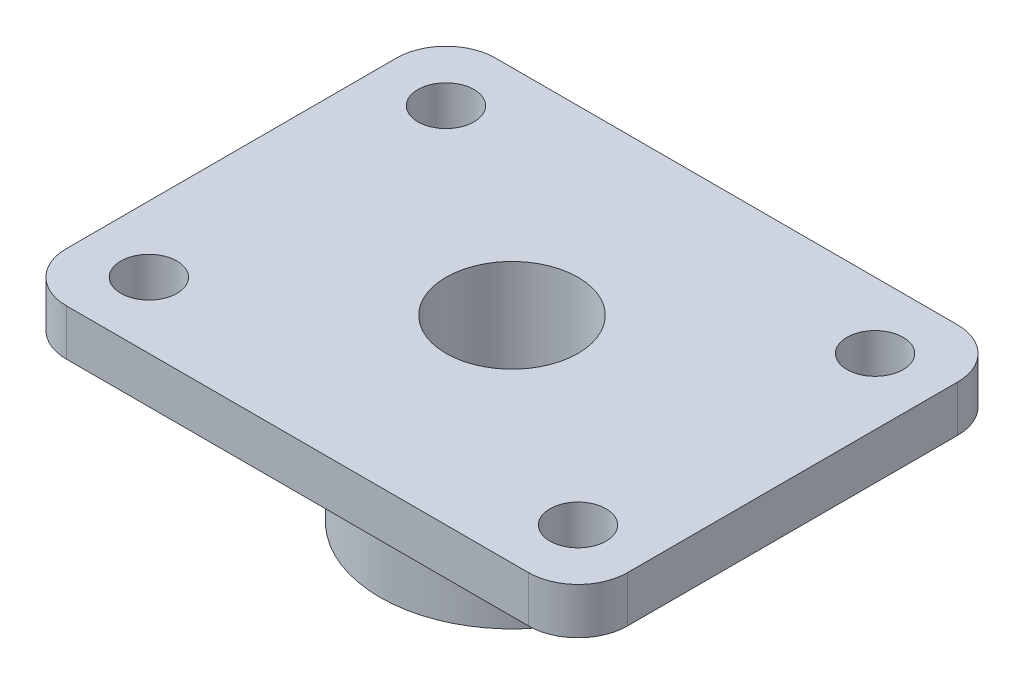
ISO-10303-21;
HEADER;
FILE_DESCRIPTION(('STEP AP214'),'2;1');
FILE_NAME('part.step','',(''),(''),'','','');
FILE_SCHEMA(('AUTOMOTIVE_DESIGN { 1 0 10303 214 1 1 1 1 }'));
ENDSEC;
DATA;
#1=APPLICATION_CONTEXT('core data for automotive mechanical design processes');
#2=APPLICATION_PROTOCOL_DEFINITION('international standard','automotive_design',2000,#1);
#3=PRODUCT_CONTEXT('',#1,'mechanical');
#4=PRODUCT('Part','Part','',(#3));
#5=PRODUCT_RELATED_PRODUCT_CATEGORY('part','',(#4));
#6=PRODUCT_DEFINITION_FORMATION('','',#4);
#7=PRODUCT_DEFINITION_CONTEXT('part definition',#1,'design');
#8=PRODUCT_DEFINITION('design','',#6,#7);
#9=PRODUCT_DEFINITION_SHAPE('','',#8);
#10=(LENGTH_UNIT() NAMED_UNIT(*) SI_UNIT(.MILLI.,.METRE.));
#11=(NAMED_UNIT(*) PLANE_ANGLE_UNIT() SI_UNIT($,.RADIAN.));
#12=(NAMED_UNIT(*) SI_UNIT($,.STERADIAN.) SOLID_ANGLE_UNIT());
#13=UNCERTAINTY_MEASURE_WITH_UNIT(LENGTH_MEASURE(1.E-05),#10,'distance_accuracy_value','');
#14=(GEOMETRIC_REPRESENTATION_CONTEXT(3) GLOBAL_UNCERTAINTY_ASSIGNED_CONTEXT((#13)) GLOBAL_UNIT_ASSIGNED_CONTEXT((#10,
#11,#12)) REPRESENTATION_CONTEXT('',''));
#15=CARTESIAN_POINT('',(0.,0.,0.));
#16=DIRECTION('',(0.,0.,1.));
#17=DIRECTION('',(1.,0.,0.));
#18=AXIS2_PLACEMENT_3D('',#15,#16,#17);
#19=CARTESIAN_POINT('',(70.,0.,50.));
#20=DIRECTION('',(0.,1.,0.));
#21=DIRECTION('',(0.,0.,1.));
#22=AXIS2_PLACEMENT_3D('',#19,#20,#21);
#23=PLANE('',#22);
#24=CARTESIAN_POINT('',(-65.0000000000003,0.,-44.9999999999995));
#25=DIRECTION('',(0.,1.,0.));
#26=DIRECTION('',(0.,0.,1.));
#27=AXIS2_PLACEMENT_3D('',#24,#25,#26);
#28=CIRCLE('',#27,8.50000000000001);
#29=CARTESIAN_POINT('',(-65.0000000000003,0.,-36.4999999999995));
#30=VERTEX_POINT('',#29);
#31=EDGE_CURVE('E207',#30,#30,#28,.T.);
#32=ORIENTED_EDGE('',*,*,#31,.T.);
#33=EDGE_LOOP('',(#32));
#34=FACE_BOUND('',#33,.T.);
#35=CARTESIAN_POINT('',(-64.9999999999997,0.,45.0000000000004));
#36=DIRECTION('',(0.,1.,0.));
#37=DIRECTION('',(0.,0.,-1.));
#38=AXIS2_PLACEMENT_3D('',#35,#36,#37);
#39=CIRCLE('',#38,8.49999999999998);
#40=CARTESIAN_POINT('',(-64.9999999999997,0.,36.5000000000005));
#41=VERTEX_POINT('',#40);
#42=EDGE_CURVE('E201',#41,#41,#39,.T.);
#43=ORIENTED_EDGE('',*,*,#42,.T.);
#44=EDGE_LOOP('',(#43));
#45=FACE_BOUND('',#44,.T.);
#46=CARTESIAN_POINT('',(65.,0.,-45.));
#47=DIRECTION('',(0.,1.,0.));
#48=DIRECTION('',(0.,0.,-1.));
#49=AXIS2_PLACEMENT_3D('',#46,#47,#48);
#50=CIRCLE('',#49,8.5);
#51=CARTESIAN_POINT('',(65.,0.,-53.5));
#52=VERTEX_POINT('',#51);
#53=EDGE_CURVE('E195',#52,#52,#50,.T.);
#54=ORIENTED_EDGE('',*,*,#53,.T.);
#55=EDGE_LOOP('',(#54));
#56=FACE_BOUND('',#55,.T.);
#57=CARTESIAN_POINT('',(65.,0.,45.));
#58=DIRECTION('',(0.,1.,0.));
#59=DIRECTION('',(0.,0.,1.));
#60=AXIS2_PLACEMENT_3D('',#57,#58,#59);
#61=CIRCLE('',#60,8.5);
#62=CARTESIAN_POINT('',(65.,0.,53.5));
#63=VERTEX_POINT('',#62);
#64=EDGE_CURVE('E189',#63,#63,#61,.T.);
#65=ORIENTED_EDGE('',*,*,#64,.T.);
#66=EDGE_LOOP('',(#65));
#67=FACE_BOUND('',#66,.T.);
#68=CARTESIAN_POINT('',(70.,0.,50.));
#69=DIRECTION('',(0.,1.,0.));
#70=DIRECTION('',(0.,0.,1.));
#71=AXIS2_PLACEMENT_3D('',#68,#69,#70);
#72=CIRCLE('',#71,15.);
#73=CARTESIAN_POINT('',(69.9999999999999,0.,65.));
#74=VERTEX_POINT('',#73);
#75=CARTESIAN_POINT('',(85.,0.,49.9999999999999));
#76=VERTEX_POINT('',#75);
#77=EDGE_CURVE('E134',#74,#76,#72,.T.);
#78=ORIENTED_EDGE('',*,*,#77,.F.);
#79=DIRECTION('',(1.,0.,0.));
#80=VECTOR('',#79,1.);
#81=CARTESIAN_POINT('',(-69.9999999999999,0.,65.));
#82=LINE('',#81,#80);
#83=CARTESIAN_POINT('',(-69.9999999999999,0.,65.));
#84=VERTEX_POINT('',#83);
#85=EDGE_CURVE('E87',#84,#74,#82,.T.);
#86=ORIENTED_EDGE('',*,*,#85,.F.);
#87=CARTESIAN_POINT('',(-70.,0.,50.));
#88=DIRECTION('',(0.,1.,0.));
#89=DIRECTION('',(0.,0.,1.));
#90=AXIS2_PLACEMENT_3D('',#87,#88,#89);
#91=CIRCLE('',#90,15.);
#92=CARTESIAN_POINT('',(-85.,0.,49.9999999999999));
#93=VERTEX_POINT('',#92);
#94=EDGE_CURVE('E81',#93,#84,#91,.T.);
#95=ORIENTED_EDGE('',*,*,#94,.F.);
#96=DIRECTION('',(0.,0.,1.));
#97=VECTOR('',#96,1.);
#98=CARTESIAN_POINT('',(-85.,0.,-49.9999999999999));
#99=LINE('',#98,#97);
#100=CARTESIAN_POINT('',(-85.,0.,-49.9999999999999));
#101=VERTEX_POINT('',#100);
#102=EDGE_CURVE('E124',#101,#93,#99,.T.);
#103=ORIENTED_EDGE('',*,*,#102,.F.);
#104=CARTESIAN_POINT('',(-70.,0.,-50.));
#105=DIRECTION('',(0.,1.,0.));
#106=DIRECTION('',(0.,0.,1.));
#107=AXIS2_PLACEMENT_3D('',#104,#105,#106);
#108=CIRCLE('',#107,15.);
#109=CARTESIAN_POINT('',(-69.9999999999999,0.,-65.));
#110=VERTEX_POINT('',#109);
#111=EDGE_CURVE('E144',#110,#101,#108,.T.);
#112=ORIENTED_EDGE('',*,*,#111,.F.);
#113=DIRECTION('',(-1.,0.,0.));
#114=VECTOR('',#113,1.);
#115=CARTESIAN_POINT('',(-69.9999999999999,0.,-65.));
#116=LINE('',#115,#114);
#117=CARTESIAN_POINT('',(69.9999999999999,0.,-65.));
#118=VERTEX_POINT('',#117);
#119=EDGE_CURVE('E142',#118,#110,#116,.T.);
#120=ORIENTED_EDGE('',*,*,#119,.F.);
#121=CARTESIAN_POINT('',(70.,0.,-50.));
#122=DIRECTION('',(0.,1.,0.));
#123=DIRECTION('',(0.,0.,-1.));
#124=AXIS2_PLACEMENT_3D('',#121,#122,#123);
#125=CIRCLE('',#124,15.);
#126=CARTESIAN_POINT('',(85.,0.,-49.9999999999999));
#127=VERTEX_POINT('',#126);
#128=EDGE_CURVE('E140',#127,#118,#125,.T.);
#129=ORIENTED_EDGE('',*,*,#128,.F.);
#130=DIRECTION('',(0.,0.,-1.));
#131=VECTOR('',#130,1.);
#132=CARTESIAN_POINT('',(85.,0.,-49.9999999999999));
#133=LINE('',#132,#131);
#134=EDGE_CURVE('E137',#76,#127,#133,.T.);
#135=ORIENTED_EDGE('',*,*,#134,.F.);
#136=EDGE_LOOP('',(#78,#86,#95,#103,#112,#120,#129,#135));
#137=FACE_BOUND('',#136,.T.);
#138=CARTESIAN_POINT('',(0.,0.,0.));
#139=DIRECTION('',(0.,1.,0.));
#140=DIRECTION('',(0.,0.,1.));
#141=AXIS2_PLACEMENT_3D('',#138,#139,#140);
#142=CIRCLE('',#141,40.);
#143=CARTESIAN_POINT('',(0.,0.,40.));
#144=VERTEX_POINT('',#143);
#145=EDGE_CURVE('E11',#144,#144,#142,.F.);
#146=ORIENTED_EDGE('',*,*,#145,.F.);
#147=EDGE_LOOP('',(#146));
#148=FACE_BOUND('',#147,.T.);
#149=ADVANCED_FACE('F35',(#34,#45,#56,#67,#137,#148),#23,.F.);
#150=CARTESIAN_POINT('',(70.,14.,50.));
#151=DIRECTION('',(0.,1.,0.));
#152=DIRECTION('',(0.,0.,1.));
#153=AXIS2_PLACEMENT_3D('',#150,#151,#152);
#154=PLANE('',#153);
#155=CARTESIAN_POINT('',(-64.9999999999997,14.,45.0000000000004));
#156=DIRECTION('',(0.,1.,0.));
#157=DIRECTION('',(0.,0.,-1.));
#158=AXIS2_PLACEMENT_3D('',#155,#156,#157);
#159=CIRCLE('',#158,8.49999999999998);
#160=CARTESIAN_POINT('',(-64.9999999999997,14.,36.5000000000005));
#161=VERTEX_POINT('',#160);
#162=EDGE_CURVE('E198',#161,#161,#159,.T.);
#163=ORIENTED_EDGE('',*,*,#162,.F.);
#164=EDGE_LOOP('',(#163));
#165=FACE_BOUND('',#164,.T.);
#166=CARTESIAN_POINT('',(65.,14.,45.));
#167=DIRECTION('',(0.,1.,0.));
#168=DIRECTION('',(0.,0.,1.));
#169=AXIS2_PLACEMENT_3D('',#166,#167,#168);
#170=CIRCLE('',#169,8.5);
#171=CARTESIAN_POINT('',(65.,14.,53.5));
#172=VERTEX_POINT('',#171);
#173=EDGE_CURVE('E188',#172,#172,#170,.T.);
#174=ORIENTED_EDGE('',*,*,#173,.F.);
#175=EDGE_LOOP('',(#174));
#176=FACE_BOUND('',#175,.T.);
#177=CARTESIAN_POINT('',(70.,14.,50.));
#178=DIRECTION('',(0.,1.,0.));
#179=DIRECTION('',(0.,0.,1.));
#180=AXIS2_PLACEMENT_3D('',#177,#178,#179);
#181=CIRCLE('',#180,15.);
#182=CARTESIAN_POINT('',(69.9999999999999,14.,65.));
#183=VERTEX_POINT('',#182);
#184=CARTESIAN_POINT('',(85.,14.,49.9999999999999));
#185=VERTEX_POINT('',#184);
#186=EDGE_CURVE('E149',#183,#185,#181,.T.);
#187=ORIENTED_EDGE('',*,*,#186,.T.);
#188=DIRECTION('',(0.,0.,-1.));
#189=VECTOR('',#188,1.);
#190=CARTESIAN_POINT('',(85.,14.,-49.9999999999999));
#191=LINE('',#190,#189);
#192=CARTESIAN_POINT('',(85.,14.,-49.9999999999999));
#193=VERTEX_POINT('',#192);
#194=EDGE_CURVE('E96',#185,#193,#191,.T.);
#195=ORIENTED_EDGE('',*,*,#194,.T.);
#196=CARTESIAN_POINT('',(70.,14.,-50.));
#197=DIRECTION('',(0.,1.,0.));
#198=DIRECTION('',(0.,0.,-1.));
#199=AXIS2_PLACEMENT_3D('',#196,#197,#198);
#200=CIRCLE('',#199,15.);
#201=CARTESIAN_POINT('',(69.9999999999999,14.,-65.));
#202=VERTEX_POINT('',#201);
#203=EDGE_CURVE('E180',#193,#202,#200,.T.);
#204=ORIENTED_EDGE('',*,*,#203,.T.);
#205=DIRECTION('',(-1.,0.,0.));
#206=VECTOR('',#205,1.);
#207=CARTESIAN_POINT('',(-69.9999999999999,14.,-65.));
#208=LINE('',#207,#206);
#209=CARTESIAN_POINT('',(-69.9999999999999,14.,-65.));
#210=VERTEX_POINT('',#209);
#211=EDGE_CURVE('E179',#202,#210,#208,.T.);
#212=ORIENTED_EDGE('',*,*,#211,.T.);
#213=CARTESIAN_POINT('',(-70.,14.,-50.));
#214=DIRECTION('',(0.,1.,0.));
#215=DIRECTION('',(0.,0.,1.));
#216=AXIS2_PLACEMENT_3D('',#213,#214,#215);
#217=CIRCLE('',#216,15.);
#218=CARTESIAN_POINT('',(-85.,14.,-49.9999999999999));
#219=VERTEX_POINT('',#218);
#220=EDGE_CURVE('E116',#210,#219,#217,.T.);
#221=ORIENTED_EDGE('',*,*,#220,.T.);
#222=DIRECTION('',(0.,0.,1.));
#223=VECTOR('',#222,1.);
#224=CARTESIAN_POINT('',(-85.,14.,-49.9999999999999));
#225=LINE('',#224,#223);
#226=CARTESIAN_POINT('',(-85.,14.,49.9999999999999));
#227=VERTEX_POINT('',#226);
#228=EDGE_CURVE('E109',#219,#227,#225,.T.);
#229=ORIENTED_EDGE('',*,*,#228,.T.);
#230=CARTESIAN_POINT('',(-70.,14.,50.));
#231=DIRECTION('',(0.,1.,0.));
#232=DIRECTION('',(0.,0.,1.));
#233=AXIS2_PLACEMENT_3D('',#230,#231,#232);
#234=CIRCLE('',#233,15.);
#235=CARTESIAN_POINT('',(-69.9999999999999,14.,65.));
#236=VERTEX_POINT('',#235);
#237=EDGE_CURVE('E114',#227,#236,#234,.T.);
#238=ORIENTED_EDGE('',*,*,#237,.T.);
#239=DIRECTION('',(1.,0.,0.));
#240=VECTOR('',#239,1.);
#241=CARTESIAN_POINT('',(-69.9999999999999,14.,65.));
#242=LINE('',#241,#240);
#243=EDGE_CURVE('E52',#236,#183,#242,.T.);
#244=ORIENTED_EDGE('',*,*,#243,.T.);
#245=EDGE_LOOP('',(#187,#195,#204,#212,#221,#229,#238,#244));
#246=FACE_BOUND('',#245,.T.);
#247=CARTESIAN_POINT('',(0.,14.,0.));
#248=DIRECTION('',(0.,1.,0.));
#249=DIRECTION('',(0.,0.,1.));
#250=AXIS2_PLACEMENT_3D('',#247,#248,#249);
#251=CIRCLE('',#250,20.);
#252=CARTESIAN_POINT('',(0.,14.,20.));
#253=VERTEX_POINT('',#252);
#254=EDGE_CURVE('E138',#253,#253,#251,.T.);
#255=ORIENTED_EDGE('',*,*,#254,.F.);
#256=EDGE_LOOP('',(#255));
#257=FACE_BOUND('',#256,.T.);
#258=CARTESIAN_POINT('',(65.,14.,-45.));
#259=DIRECTION('',(0.,1.,0.));
#260=DIRECTION('',(0.,0.,-1.));
#261=AXIS2_PLACEMENT_3D('',#258,#259,#260);
#262=CIRCLE('',#261,8.5);
#263=CARTESIAN_POINT('',(65.,14.,-53.5));
#264=VERTEX_POINT('',#263);
#265=EDGE_CURVE('E192',#264,#264,#262,.T.);
#266=ORIENTED_EDGE('',*,*,#265,.F.);
#267=EDGE_LOOP('',(#266));
#268=FACE_BOUND('',#267,.T.);
#269=CARTESIAN_POINT('',(-65.0000000000003,14.,-44.9999999999995));
#270=DIRECTION('',(0.,1.,0.));
#271=DIRECTION('',(0.,0.,1.));
#272=AXIS2_PLACEMENT_3D('',#269,#270,#271);
#273=CIRCLE('',#272,8.50000000000001);
#274=CARTESIAN_POINT('',(-65.0000000000003,14.,-36.4999999999995));
#275=VERTEX_POINT('',#274);
#276=EDGE_CURVE('E204',#275,#275,#273,.T.);
#277=ORIENTED_EDGE('',*,*,#276,.F.);
#278=EDGE_LOOP('',(#277));
#279=FACE_BOUND('',#278,.T.);
#280=ADVANCED_FACE('F111',(#165,#176,#246,#257,#268,#279),#154,.T.);
#281=CARTESIAN_POINT('',(70.,14.,50.));
#282=DIRECTION('',(0.,-1.,0.));
#283=DIRECTION('',(0.,0.,-1.));
#284=AXIS2_PLACEMENT_3D('',#281,#282,#283);
#285=CYLINDRICAL_SURFACE('',#284,15.);
#286=ORIENTED_EDGE('',*,*,#77,.T.);
#287=DIRECTION('',(0.,-1.,0.));
#288=VECTOR('',#287,1.);
#289=CARTESIAN_POINT('',(85.,14.,49.9999999999999));
#290=LINE('',#289,#288);
#291=EDGE_CURVE('E44',#185,#76,#290,.T.);
#292=ORIENTED_EDGE('',*,*,#291,.F.);
#293=ORIENTED_EDGE('',*,*,#186,.F.);
#294=DIRECTION('',(0.,-1.,0.));
#295=VECTOR('',#294,1.);
#296=CARTESIAN_POINT('',(69.9999999999999,14.,65.));
#297=LINE('',#296,#295);
#298=EDGE_CURVE('E130',#183,#74,#297,.T.);
#299=ORIENTED_EDGE('',*,*,#298,.T.);
#300=EDGE_LOOP('',(#286,#292,#293,#299));
#301=FACE_BOUND('',#300,.T.);
#302=ADVANCED_FACE('F37',(#301),#285,.T.);
#303=CARTESIAN_POINT('',(85.,14.,-49.9999999999999));
#304=DIRECTION('',(-1.,0.,0.));
#305=DIRECTION('',(0.,0.,1.));
#306=AXIS2_PLACEMENT_3D('',#303,#304,#305);
#307=PLANE('',#306);
#308=ORIENTED_EDGE('',*,*,#134,.T.);
#309=DIRECTION('',(0.,-1.,0.));
#310=VECTOR('',#309,1.);
#311=CARTESIAN_POINT('',(85.,14.,-49.9999999999999));
#312=LINE('',#311,#310);
#313=EDGE_CURVE('E159',#193,#127,#312,.T.);
#314=ORIENTED_EDGE('',*,*,#313,.F.);
#315=ORIENTED_EDGE('',*,*,#194,.F.);
#316=ORIENTED_EDGE('',*,*,#291,.T.);
#317=EDGE_LOOP('',(#308,#314,#315,#316));
#318=FACE_BOUND('',#317,.T.);
#319=ADVANCED_FACE('F162',(#318),#307,.F.);
#320=CARTESIAN_POINT('',(70.,14.,-50.));
#321=DIRECTION('',(0.,-1.,0.));
#322=DIRECTION('',(0.,0.,-1.));
#323=AXIS2_PLACEMENT_3D('',#320,#321,#322);
#324=CYLINDRICAL_SURFACE('',#323,15.);
#325=ORIENTED_EDGE('',*,*,#128,.T.);
#326=DIRECTION('',(0.,-1.,0.));
#327=VECTOR('',#326,1.);
#328=CARTESIAN_POINT('',(69.9999999999999,14.,-65.));
#329=LINE('',#328,#327);
#330=EDGE_CURVE('E156',#202,#118,#329,.T.);
#331=ORIENTED_EDGE('',*,*,#330,.F.);
#332=ORIENTED_EDGE('',*,*,#203,.F.);
#333=ORIENTED_EDGE('',*,*,#313,.T.);
#334=EDGE_LOOP('',(#325,#331,#332,#333));
#335=FACE_BOUND('',#334,.T.);
#336=ADVANCED_FACE('F173',(#335),#324,.T.);
#337=CARTESIAN_POINT('',(-69.9999999999999,14.,-65.));
#338=DIRECTION('',(0.,0.,1.));
#339=DIRECTION('',(1.,0.,0.));
#340=AXIS2_PLACEMENT_3D('',#337,#338,#339);
#341=PLANE('',#340);
#342=ORIENTED_EDGE('',*,*,#119,.T.);
#343=DIRECTION('',(0.,-1.,0.));
#344=VECTOR('',#343,1.);
#345=CARTESIAN_POINT('',(-69.9999999999999,14.,-65.));
#346=LINE('',#345,#344);
#347=EDGE_CURVE('E153',#210,#110,#346,.T.);
#348=ORIENTED_EDGE('',*,*,#347,.F.);
#349=ORIENTED_EDGE('',*,*,#211,.F.);
#350=ORIENTED_EDGE('',*,*,#330,.T.);
#351=EDGE_LOOP('',(#342,#348,#349,#350));
#352=FACE_BOUND('',#351,.T.);
#353=ADVANCED_FACE('F177',(#352),#341,.F.);
#354=CARTESIAN_POINT('',(-70.,14.,-50.));
#355=DIRECTION('',(0.,-1.,0.));
#356=DIRECTION('',(0.,0.,-1.));
#357=AXIS2_PLACEMENT_3D('',#354,#355,#356);
#358=CYLINDRICAL_SURFACE('',#357,15.);
#359=ORIENTED_EDGE('',*,*,#111,.T.);
#360=DIRECTION('',(0.,-1.,0.));
#361=VECTOR('',#360,1.);
#362=CARTESIAN_POINT('',(-85.,14.,-49.9999999999999));
#363=LINE('',#362,#361);
#364=EDGE_CURVE('E125',#219,#101,#363,.T.);
#365=ORIENTED_EDGE('',*,*,#364,.F.);
#366=ORIENTED_EDGE('',*,*,#220,.F.);
#367=ORIENTED_EDGE('',*,*,#347,.T.);
#368=EDGE_LOOP('',(#359,#365,#366,#367));
#369=FACE_BOUND('',#368,.T.);
#370=ADVANCED_FACE('F254',(#369),#358,.T.);
#371=CARTESIAN_POINT('',(-85.,14.,-49.9999999999999));
#372=DIRECTION('',(1.,0.,0.));
#373=DIRECTION('',(0.,0.,-1.));
#374=AXIS2_PLACEMENT_3D('',#371,#372,#373);
#375=PLANE('',#374);
#376=ORIENTED_EDGE('',*,*,#102,.T.);
#377=DIRECTION('',(0.,-1.,0.));
#378=VECTOR('',#377,1.);
#379=CARTESIAN_POINT('',(-85.,14.,49.9999999999999));
#380=LINE('',#379,#378);
#381=EDGE_CURVE('E121',#227,#93,#380,.T.);
#382=ORIENTED_EDGE('',*,*,#381,.F.);
#383=ORIENTED_EDGE('',*,*,#228,.F.);
#384=ORIENTED_EDGE('',*,*,#364,.T.);
#385=EDGE_LOOP('',(#376,#382,#383,#384));
#386=FACE_BOUND('',#385,.T.);
#387=ADVANCED_FACE('F122',(#386),#375,.F.);
#388=CARTESIAN_POINT('',(-70.,14.,50.));
#389=DIRECTION('',(0.,-1.,0.));
#390=DIRECTION('',(0.,0.,-1.));
#391=AXIS2_PLACEMENT_3D('',#388,#389,#390);
#392=CYLINDRICAL_SURFACE('',#391,15.);
#393=ORIENTED_EDGE('',*,*,#94,.T.);
#394=DIRECTION('',(0.,-1.,0.));
#395=VECTOR('',#394,1.);
#396=CARTESIAN_POINT('',(-69.9999999999999,14.,65.));
#397=LINE('',#396,#395);
#398=EDGE_CURVE('E126',#236,#84,#397,.T.);
#399=ORIENTED_EDGE('',*,*,#398,.F.);
#400=ORIENTED_EDGE('',*,*,#237,.F.);
#401=ORIENTED_EDGE('',*,*,#381,.T.);
#402=EDGE_LOOP('',(#393,#399,#400,#401));
#403=FACE_BOUND('',#402,.T.);
#404=ADVANCED_FACE('F128',(#403),#392,.T.);
#405=CARTESIAN_POINT('',(-69.9999999999999,14.,65.));
#406=DIRECTION('',(0.,0.,-1.));
#407=DIRECTION('',(-1.,0.,0.));
#408=AXIS2_PLACEMENT_3D('',#405,#406,#407);
#409=PLANE('',#408);
#410=ORIENTED_EDGE('',*,*,#85,.T.);
#411=ORIENTED_EDGE('',*,*,#298,.F.);
#412=ORIENTED_EDGE('',*,*,#243,.F.);
#413=ORIENTED_EDGE('',*,*,#398,.T.);
#414=EDGE_LOOP('',(#410,#411,#412,#413));
#415=FACE_BOUND('',#414,.T.);
#416=ADVANCED_FACE('F247',(#415),#409,.F.);
#417=CARTESIAN_POINT('',(0.,14.,0.));
#418=DIRECTION('',(0.,-1.,0.));
#419=DIRECTION('',(0.,0.,-1.));
#420=AXIS2_PLACEMENT_3D('',#417,#418,#419);
#421=CYLINDRICAL_SURFACE('',#420,20.);
#422=ORIENTED_EDGE('',*,*,#254,.T.);
#423=EDGE_LOOP('',(#422));
#424=FACE_BOUND('',#423,.T.);
#425=CARTESIAN_POINT('',(0.,-40.,0.));
#426=DIRECTION('',(0.,-1.,0.));
#427=DIRECTION('',(0.,0.,-1.));
#428=AXIS2_PLACEMENT_3D('',#425,#426,#427);
#429=CIRCLE('',#428,20.);
#430=CARTESIAN_POINT('',(0.,-40.,-20.));
#431=VERTEX_POINT('',#430);
#432=EDGE_CURVE('E215',#431,#431,#429,.T.);
#433=ORIENTED_EDGE('',*,*,#432,.T.);
#434=EDGE_LOOP('',(#433));
#435=FACE_BOUND('',#434,.T.);
#436=ADVANCED_FACE('F219',(#424,#435),#421,.F.);
#437=CARTESIAN_POINT('',(65.,14.,45.));
#438=DIRECTION('',(0.,-1.,0.));
#439=DIRECTION('',(0.,0.,-1.));
#440=AXIS2_PLACEMENT_3D('',#437,#438,#439);
#441=CYLINDRICAL_SURFACE('',#440,8.5);
#442=ORIENTED_EDGE('',*,*,#173,.T.);
#443=EDGE_LOOP('',(#442));
#444=FACE_BOUND('',#443,.T.);
#445=ORIENTED_EDGE('',*,*,#64,.F.);
#446=EDGE_LOOP('',(#445));
#447=FACE_BOUND('',#446,.T.);
#448=ADVANCED_FACE('F318',(#444,#447),#441,.F.);
#449=CARTESIAN_POINT('',(65.,14.,-45.));
#450=DIRECTION('',(0.,-1.,0.));
#451=DIRECTION('',(0.,0.,-1.));
#452=AXIS2_PLACEMENT_3D('',#449,#450,#451);
#453=CYLINDRICAL_SURFACE('',#452,8.5);
#454=ORIENTED_EDGE('',*,*,#265,.T.);
#455=EDGE_LOOP('',(#454));
#456=FACE_BOUND('',#455,.T.);
#457=ORIENTED_EDGE('',*,*,#53,.F.);
#458=EDGE_LOOP('',(#457));
#459=FACE_BOUND('',#458,.T.);
#460=ADVANCED_FACE('F329',(#456,#459),#453,.F.);
#461=CARTESIAN_POINT('',(-64.9999999999997,14.,45.0000000000004));
#462=DIRECTION('',(0.,-1.,0.));
#463=DIRECTION('',(0.,0.,-1.));
#464=AXIS2_PLACEMENT_3D('',#461,#462,#463);
#465=CYLINDRICAL_SURFACE('',#464,8.49999999999998);
#466=ORIENTED_EDGE('',*,*,#162,.T.);
#467=EDGE_LOOP('',(#466));
#468=FACE_BOUND('',#467,.T.);
#469=ORIENTED_EDGE('',*,*,#42,.F.);
#470=EDGE_LOOP('',(#469));
#471=FACE_BOUND('',#470,.T.);
#472=ADVANCED_FACE('F233',(#468,#471),#465,.F.);
#473=CARTESIAN_POINT('',(-65.0000000000003,14.,-44.9999999999995));
#474=DIRECTION('',(0.,-1.,0.));
#475=DIRECTION('',(0.,0.,-1.));
#476=AXIS2_PLACEMENT_3D('',#473,#474,#475);
#477=CYLINDRICAL_SURFACE('',#476,8.50000000000001);
#478=ORIENTED_EDGE('',*,*,#276,.T.);
#479=EDGE_LOOP('',(#478));
#480=FACE_BOUND('',#479,.T.);
#481=ORIENTED_EDGE('',*,*,#31,.F.);
#482=EDGE_LOOP('',(#481));
#483=FACE_BOUND('',#482,.T.);
#484=ADVANCED_FACE('F224',(#480,#483),#477,.F.);
#485=CARTESIAN_POINT('',(0.,-40.,0.));
#486=DIRECTION('',(0.,-1.,0.));
#487=DIRECTION('',(0.,0.,-1.));
#488=AXIS2_PLACEMENT_3D('',#485,#486,#487);
#489=PLANE('',#488);
#490=CARTESIAN_POINT('',(0.,-40.,0.));
#491=DIRECTION('',(0.,-1.,0.));
#492=DIRECTION('',(0.,0.,-1.));
#493=AXIS2_PLACEMENT_3D('',#490,#491,#492);
#494=CIRCLE('',#493,40.);
#495=CARTESIAN_POINT('',(0.,-40.,-40.));
#496=VERTEX_POINT('',#495);
#497=EDGE_CURVE('E210',#496,#496,#494,.T.);
#498=ORIENTED_EDGE('',*,*,#497,.T.);
#499=EDGE_LOOP('',(#498));
#500=FACE_BOUND('',#499,.T.);
#501=ORIENTED_EDGE('',*,*,#432,.F.);
#502=EDGE_LOOP('',(#501));
#503=FACE_BOUND('',#502,.T.);
#504=ADVANCED_FACE('F221',(#500,#503),#489,.T.);
#505=CARTESIAN_POINT('',(0.,-40.,0.));
#506=DIRECTION('',(0.,1.,0.));
#507=DIRECTION('',(0.,0.,1.));
#508=AXIS2_PLACEMENT_3D('',#505,#506,#507);
#509=CYLINDRICAL_SURFACE('',#508,40.);
#510=ORIENTED_EDGE('',*,*,#497,.F.);
#511=EDGE_LOOP('',(#510));
#512=FACE_BOUND('',#511,.T.);
#513=ORIENTED_EDGE('',*,*,#145,.T.);
#514=EDGE_LOOP('',(#513));
#515=FACE_BOUND('',#514,.T.);
#516=ADVANCED_FACE('F223',(#512,#515),#509,.T.);
#517=CLOSED_SHELL('',(#149,#280,#302,#319,#336,#353,#370,#387,#404,#416,#436,#448,#460,#472,
#484,#504,#516));
#518=MANIFOLD_SOLID_BREP('B2',#517);
#519=ADVANCED_BREP_SHAPE_REPRESENTATION('',(#18,#518),#14);
#520=SHAPE_DEFINITION_REPRESENTATION(#9,#519);
ENDSEC;
END-ISO-10303-21;
